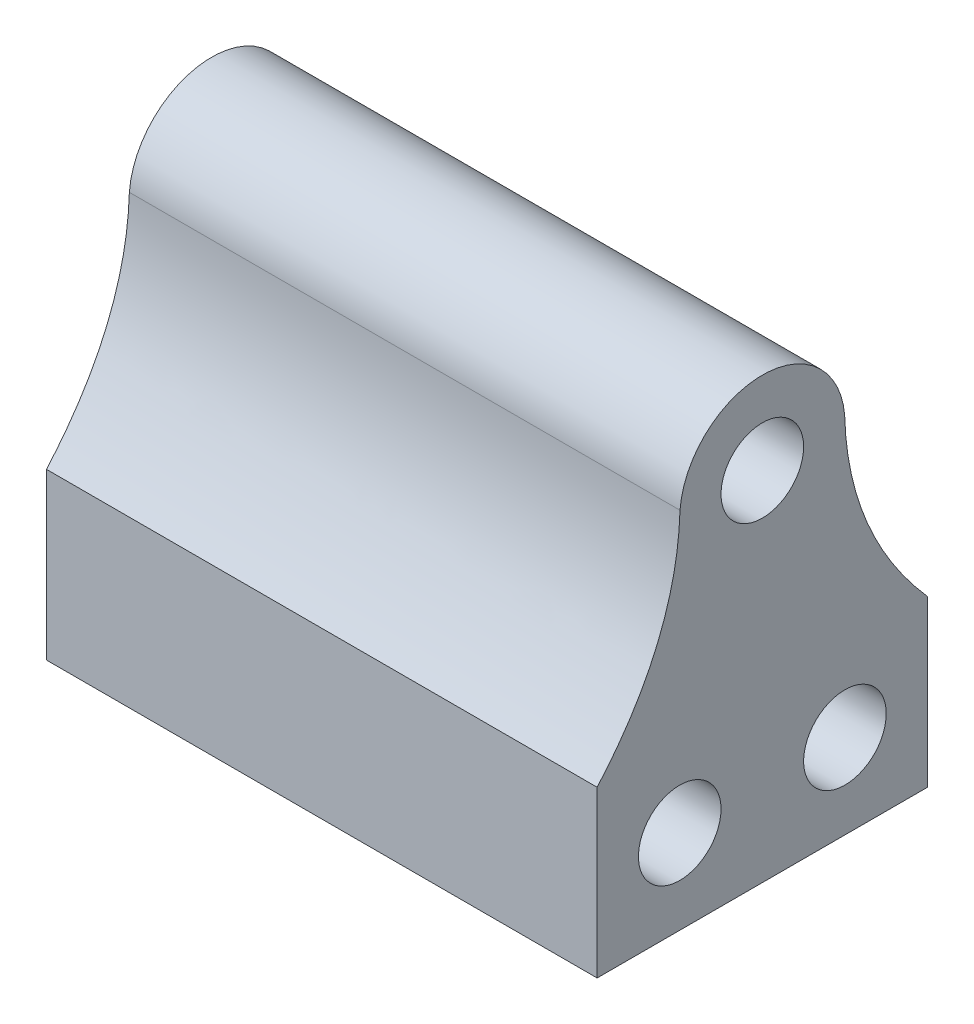
ISO-10303-21;
HEADER;
FILE_DESCRIPTION(('STEP AP214'),'2;1');
FILE_NAME('part.step','',(''),(''),'','','');
FILE_SCHEMA(('AUTOMOTIVE_DESIGN { 1 0 10303 214 1 1 1 1 }'));
ENDSEC;
DATA;
#1=APPLICATION_CONTEXT('core data for automotive mechanical design processes');
#2=APPLICATION_PROTOCOL_DEFINITION('international standard','automotive_design',2000,#1);
#3=PRODUCT_CONTEXT('',#1,'mechanical');
#4=PRODUCT('Part','Part','',(#3));
#5=PRODUCT_RELATED_PRODUCT_CATEGORY('part','',(#4));
#6=PRODUCT_DEFINITION_FORMATION('','',#4);
#7=PRODUCT_DEFINITION_CONTEXT('part definition',#1,'design');
#8=PRODUCT_DEFINITION('design','',#6,#7);
#9=PRODUCT_DEFINITION_SHAPE('','',#8);
#10=(LENGTH_UNIT() NAMED_UNIT(*) SI_UNIT(.MILLI.,.METRE.));
#11=(NAMED_UNIT(*) PLANE_ANGLE_UNIT() SI_UNIT($,.RADIAN.));
#12=(NAMED_UNIT(*) SI_UNIT($,.STERADIAN.) SOLID_ANGLE_UNIT());
#13=UNCERTAINTY_MEASURE_WITH_UNIT(LENGTH_MEASURE(1.E-05),#10,'distance_accuracy_value','');
#14=(GEOMETRIC_REPRESENTATION_CONTEXT(3) GLOBAL_UNCERTAINTY_ASSIGNED_CONTEXT((#13)) GLOBAL_UNIT_ASSIGNED_CONTEXT((#10,
#11,#12)) REPRESENTATION_CONTEXT('',''));
#15=CARTESIAN_POINT('',(0.,0.,0.));
#16=DIRECTION('',(0.,0.,1.));
#17=DIRECTION('',(1.,0.,0.));
#18=AXIS2_PLACEMENT_3D('',#15,#16,#17);
#19=CARTESIAN_POINT('',(-50.,30.,-30.));
#20=DIRECTION('',(1.,0.,0.));
#21=DIRECTION('',(0.,0.,-1.));
#22=AXIS2_PLACEMENT_3D('',#19,#20,#21);
#23=PLANE('',#22);
#24=CARTESIAN_POINT('',(-50.,64.8232846353852,0.));
#25=DIRECTION('',(1.,0.,0.));
#26=DIRECTION('',(0.,0.,-1.));
#27=AXIS2_PLACEMENT_3D('',#24,#25,#26);
#28=CIRCLE('',#27,7.5);
#29=CARTESIAN_POINT('',(-50.,64.8232846353852,-7.49999999999999));
#30=VERTEX_POINT('',#29);
#31=EDGE_CURVE('E204',#30,#30,#28,.T.);
#32=ORIENTED_EDGE('',*,*,#31,.T.);
#33=EDGE_LOOP('',(#32));
#34=FACE_BOUND('',#33,.T.);
#35=CARTESIAN_POINT('',(-50.,15.3368751333688,15.));
#36=DIRECTION('',(1.,0.,0.));
#37=DIRECTION('',(0.,0.,-1.));
#38=AXIS2_PLACEMENT_3D('',#35,#36,#37);
#39=CIRCLE('',#38,7.5);
#40=CARTESIAN_POINT('',(-50.,15.3368751333688,7.50000000000001));
#41=VERTEX_POINT('',#40);
#42=EDGE_CURVE('E215',#41,#41,#39,.T.);
#43=ORIENTED_EDGE('',*,*,#42,.T.);
#44=EDGE_LOOP('',(#43));
#45=FACE_BOUND('',#44,.T.);
#46=CARTESIAN_POINT('',(-50.,15.3368751333688,-15.));
#47=DIRECTION('',(1.,0.,0.));
#48=DIRECTION('',(0.,0.,-1.));
#49=AXIS2_PLACEMENT_3D('',#46,#47,#48);
#50=CIRCLE('',#49,7.5);
#51=CARTESIAN_POINT('',(-50.,15.3368751333688,-22.5));
#52=VERTEX_POINT('',#51);
#53=EDGE_CURVE('E225',#52,#52,#50,.T.);
#54=ORIENTED_EDGE('',*,*,#53,.T.);
#55=EDGE_LOOP('',(#54));
#56=FACE_BOUND('',#55,.T.);
#57=DIRECTION('',(0.,0.,1.));
#58=VECTOR('',#57,1.);
#59=CARTESIAN_POINT('',(-50.,0.,-30.));
#60=LINE('',#59,#58);
#61=CARTESIAN_POINT('',(-50.,0.,-30.));
#62=VERTEX_POINT('',#61);
#63=CARTESIAN_POINT('',(-50.,0.,30.));
#64=VERTEX_POINT('',#63);
#65=EDGE_CURVE('E168',#62,#64,#60,.T.);
#66=ORIENTED_EDGE('',*,*,#65,.T.);
#67=DIRECTION('',(0.,-1.,0.));
#68=VECTOR('',#67,1.);
#69=CARTESIAN_POINT('',(-50.,30.,30.));
#70=LINE('',#69,#68);
#71=CARTESIAN_POINT('',(-50.,30.,30.));
#72=VERTEX_POINT('',#71);
#73=EDGE_CURVE('E11',#72,#64,#70,.T.);
#74=ORIENTED_EDGE('',*,*,#73,.F.);
#75=CARTESIAN_POINT('',(-50.,66.0445948713286,14.9501973668437));
#76=CARTESIAN_POINT('',(-50.,46.442080305185,15.5306586318071));
#77=CARTESIAN_POINT('',(-50.,30.,30.));
#78=B_SPLINE_CURVE_WITH_KNOTS('',2,(#75,#76,#77),.UNSPECIFIED.,.F.,.F.,(3,3),(0.,1.),.UNSPECIFIED.);
#79=CARTESIAN_POINT('',(-50.,66.0445948713286,14.9501973668437));
#80=VERTEX_POINT('',#79);
#81=EDGE_CURVE('E120',#80,#72,#78,.T.);
#82=ORIENTED_EDGE('',*,*,#81,.F.);
#83=CARTESIAN_POINT('',(-50.,64.8232846353852,0.));
#84=DIRECTION('',(1.,0.,0.));
#85=DIRECTION('',(0.,0.,-1.));
#86=AXIS2_PLACEMENT_3D('',#83,#84,#85);
#87=CIRCLE('',#86,15.);
#88=CARTESIAN_POINT('',(-50.,65.984799867028,-14.9549617975661));
#89=VERTEX_POINT('',#88);
#90=EDGE_CURVE('E118',#89,#80,#87,.T.);
#91=ORIENTED_EDGE('',*,*,#90,.F.);
#92=CARTESIAN_POINT('',(-50.,30.,-30.));
#93=CARTESIAN_POINT('',(-50.,46.4130499455751,-15.5046375981463));
#94=CARTESIAN_POINT('',(-50.,65.984799867028,-14.9549617975661));
#95=B_SPLINE_CURVE_WITH_KNOTS('',2,(#92,#93,#94),.UNSPECIFIED.,.F.,.F.,(3,3),(0.,1.),.UNSPECIFIED.);
#96=CARTESIAN_POINT('',(-50.,30.,-30.));
#97=VERTEX_POINT('',#96);
#98=EDGE_CURVE('E111',#97,#89,#95,.T.);
#99=ORIENTED_EDGE('',*,*,#98,.F.);
#100=DIRECTION('',(0.,-1.,0.));
#101=VECTOR('',#100,1.);
#102=CARTESIAN_POINT('',(-50.,30.,-30.));
#103=LINE('',#102,#101);
#104=EDGE_CURVE('E97',#97,#62,#103,.T.);
#105=ORIENTED_EDGE('',*,*,#104,.T.);
#106=EDGE_LOOP('',(#66,#74,#82,#91,#99,#105));
#107=FACE_BOUND('',#106,.T.);
#108=ADVANCED_FACE('F39',(#34,#45,#56,#107),#23,.F.);
#109=CARTESIAN_POINT('',(-50.,30.,30.));
#110=DIRECTION('',(0.,0.,-1.));
#111=DIRECTION('',(-1.,0.,0.));
#112=AXIS2_PLACEMENT_3D('',#109,#110,#111);
#113=PLANE('',#112);
#114=DIRECTION('',(1.,0.,0.));
#115=VECTOR('',#114,1.);
#116=CARTESIAN_POINT('',(-50.,0.,30.));
#117=LINE('',#116,#115);
#118=CARTESIAN_POINT('',(50.,0.,30.));
#119=VERTEX_POINT('',#118);
#120=EDGE_CURVE('E166',#64,#119,#117,.T.);
#121=ORIENTED_EDGE('',*,*,#120,.T.);
#122=DIRECTION('',(0.,-1.,0.));
#123=VECTOR('',#122,1.);
#124=CARTESIAN_POINT('',(50.,30.,30.));
#125=LINE('',#124,#123);
#126=CARTESIAN_POINT('',(50.,30.,30.));
#127=VERTEX_POINT('',#126);
#128=EDGE_CURVE('E48',#127,#119,#125,.T.);
#129=ORIENTED_EDGE('',*,*,#128,.F.);
#130=DIRECTION('',(1.,0.,0.));
#131=VECTOR('',#130,1.);
#132=CARTESIAN_POINT('',(-50.,30.,30.));
#133=LINE('',#132,#131);
#134=EDGE_CURVE('E82',#72,#127,#133,.T.);
#135=ORIENTED_EDGE('',*,*,#134,.F.);
#136=ORIENTED_EDGE('',*,*,#73,.T.);
#137=EDGE_LOOP('',(#121,#129,#135,#136));
#138=FACE_BOUND('',#137,.T.);
#139=ADVANCED_FACE('F159',(#138),#113,.F.);
#140=CARTESIAN_POINT('',(50.,30.,-30.));
#141=DIRECTION('',(-1.,0.,0.));
#142=DIRECTION('',(0.,0.,1.));
#143=AXIS2_PLACEMENT_3D('',#140,#141,#142);
#144=PLANE('',#143);
#145=CARTESIAN_POINT('',(50.,64.8232846353852,0.));
#146=DIRECTION('',(1.,0.,0.));
#147=DIRECTION('',(0.,0.,-1.));
#148=AXIS2_PLACEMENT_3D('',#145,#146,#147);
#149=CIRCLE('',#148,7.5);
#150=CARTESIAN_POINT('',(50.,64.8232846353852,-7.50000000000001));
#151=VERTEX_POINT('',#150);
#152=EDGE_CURVE('E210',#151,#151,#149,.T.);
#153=ORIENTED_EDGE('',*,*,#152,.F.);
#154=EDGE_LOOP('',(#153));
#155=FACE_BOUND('',#154,.T.);
#156=CARTESIAN_POINT('',(50.,15.3368751333688,15.));
#157=DIRECTION('',(1.,0.,0.));
#158=DIRECTION('',(0.,0.,-1.));
#159=AXIS2_PLACEMENT_3D('',#156,#157,#158);
#160=CIRCLE('',#159,7.5);
#161=CARTESIAN_POINT('',(50.,15.3368751333688,7.49999999999999));
#162=VERTEX_POINT('',#161);
#163=EDGE_CURVE('E221',#162,#162,#160,.T.);
#164=ORIENTED_EDGE('',*,*,#163,.F.);
#165=EDGE_LOOP('',(#164));
#166=FACE_BOUND('',#165,.T.);
#167=CARTESIAN_POINT('',(50.,15.3368751333688,-15.));
#168=DIRECTION('',(1.,0.,0.));
#169=DIRECTION('',(0.,0.,-1.));
#170=AXIS2_PLACEMENT_3D('',#167,#168,#169);
#171=CIRCLE('',#170,7.5);
#172=CARTESIAN_POINT('',(50.,15.3368751333688,-22.5));
#173=VERTEX_POINT('',#172);
#174=EDGE_CURVE('E228',#173,#173,#171,.T.);
#175=ORIENTED_EDGE('',*,*,#174,.F.);
#176=EDGE_LOOP('',(#175));
#177=FACE_BOUND('',#176,.T.);
#178=DIRECTION('',(0.,0.,-1.));
#179=VECTOR('',#178,1.);
#180=CARTESIAN_POINT('',(50.,0.,-30.));
#181=LINE('',#180,#179);
#182=CARTESIAN_POINT('',(50.,0.,-30.));
#183=VERTEX_POINT('',#182);
#184=EDGE_CURVE('E72',#119,#183,#181,.T.);
#185=ORIENTED_EDGE('',*,*,#184,.T.);
#186=DIRECTION('',(0.,-1.,0.));
#187=VECTOR('',#186,1.);
#188=CARTESIAN_POINT('',(50.,30.,-30.));
#189=LINE('',#188,#187);
#190=CARTESIAN_POINT('',(50.,30.,-30.));
#191=VERTEX_POINT('',#190);
#192=EDGE_CURVE('E56',#191,#183,#189,.T.);
#193=ORIENTED_EDGE('',*,*,#192,.F.);
#194=CARTESIAN_POINT('',(50.,30.,-30.));
#195=CARTESIAN_POINT('',(50.,46.4130499455751,-15.5046375981464));
#196=CARTESIAN_POINT('',(50.,65.984799867028,-14.9549617975661));
#197=B_SPLINE_CURVE_WITH_KNOTS('',2,(#194,#195,#196),.UNSPECIFIED.,.F.,.F.,(3,3),(0.,1.),.UNSPECIFIED.);
#198=CARTESIAN_POINT('',(50.,65.984799867028,-14.9549617975661));
#199=VERTEX_POINT('',#198);
#200=EDGE_CURVE('E113',#191,#199,#197,.T.);
#201=ORIENTED_EDGE('',*,*,#200,.T.);
#202=CARTESIAN_POINT('',(50.,64.8232846353852,0.));
#203=DIRECTION('',(1.,0.,0.));
#204=DIRECTION('',(0.,0.,-1.));
#205=AXIS2_PLACEMENT_3D('',#202,#203,#204);
#206=CIRCLE('',#205,15.);
#207=CARTESIAN_POINT('',(50.,66.0445948713286,14.9501973668437));
#208=VERTEX_POINT('',#207);
#209=EDGE_CURVE('E127',#199,#208,#206,.T.);
#210=ORIENTED_EDGE('',*,*,#209,.T.);
#211=CARTESIAN_POINT('',(50.,66.0445948713286,14.9501973668437));
#212=CARTESIAN_POINT('',(50.,46.442080305185,15.5306586318071));
#213=CARTESIAN_POINT('',(50.,30.,30.));
#214=B_SPLINE_CURVE_WITH_KNOTS('',2,(#211,#212,#213),.UNSPECIFIED.,.F.,.F.,(3,3),(0.,1.),.UNSPECIFIED.);
#215=EDGE_CURVE('E173',#208,#127,#214,.T.);
#216=ORIENTED_EDGE('',*,*,#215,.T.);
#217=ORIENTED_EDGE('',*,*,#128,.T.);
#218=EDGE_LOOP('',(#185,#193,#201,#210,#216,#217));
#219=FACE_BOUND('',#218,.T.);
#220=ADVANCED_FACE('F157',(#155,#166,#177,#219),#144,.F.);
#221=CARTESIAN_POINT('',(-50.,30.,-30.));
#222=DIRECTION('',(0.,0.,1.));
#223=DIRECTION('',(1.,0.,0.));
#224=AXIS2_PLACEMENT_3D('',#221,#222,#223);
#225=PLANE('',#224);
#226=DIRECTION('',(-1.,0.,0.));
#227=VECTOR('',#226,1.);
#228=CARTESIAN_POINT('',(-50.,0.,-30.));
#229=LINE('',#228,#227);
#230=EDGE_CURVE('E77',#183,#62,#229,.T.);
#231=ORIENTED_EDGE('',*,*,#230,.T.);
#232=ORIENTED_EDGE('',*,*,#104,.F.);
#233=DIRECTION('',(-1.,0.,0.));
#234=VECTOR('',#233,1.);
#235=CARTESIAN_POINT('',(-50.,30.,-30.));
#236=LINE('',#235,#234);
#237=EDGE_CURVE('E100',#191,#97,#236,.T.);
#238=ORIENTED_EDGE('',*,*,#237,.F.);
#239=ORIENTED_EDGE('',*,*,#192,.T.);
#240=EDGE_LOOP('',(#231,#232,#238,#239));
#241=FACE_BOUND('',#240,.T.);
#242=ADVANCED_FACE('F99',(#241),#225,.F.);
#243=CARTESIAN_POINT('',(0.,0.,0.));
#244=DIRECTION('',(0.,1.,0.));
#245=DIRECTION('',(0.,0.,1.));
#246=AXIS2_PLACEMENT_3D('',#243,#244,#245);
#247=PLANE('',#246);
#248=ORIENTED_EDGE('',*,*,#65,.F.);
#249=ORIENTED_EDGE('',*,*,#230,.F.);
#250=ORIENTED_EDGE('',*,*,#184,.F.);
#251=ORIENTED_EDGE('',*,*,#120,.F.);
#252=EDGE_LOOP('',(#248,#249,#250,#251));
#253=FACE_BOUND('',#252,.T.);
#254=ADVANCED_FACE('F150',(#253),#247,.F.);
#255=DIRECTION('',(1.,0.,0.));
#256=VECTOR('',#255,1.);
#257=SURFACE_OF_LINEAR_EXTRUSION('',#78,#256);
#258=ORIENTED_EDGE('',*,*,#215,.F.);
#259=DIRECTION('',(1.,0.,0.));
#260=VECTOR('',#259,1.);
#261=CARTESIAN_POINT('',(-50.,66.0445948713286,14.9501973668437));
#262=LINE('',#261,#260);
#263=EDGE_CURVE('E187',#80,#208,#262,.T.);
#264=ORIENTED_EDGE('',*,*,#263,.F.);
#265=ORIENTED_EDGE('',*,*,#81,.T.);
#266=ORIENTED_EDGE('',*,*,#134,.T.);
#267=EDGE_LOOP('',(#258,#264,#265,#266));
#268=FACE_BOUND('',#267,.T.);
#269=ADVANCED_FACE('F147',(#268),#257,.T.);
#270=CARTESIAN_POINT('',(-50.,64.8232846353852,0.));
#271=DIRECTION('',(1.,0.,0.));
#272=DIRECTION('',(0.,0.,-1.));
#273=AXIS2_PLACEMENT_3D('',#270,#271,#272);
#274=CYLINDRICAL_SURFACE('',#273,15.);
#275=ORIENTED_EDGE('',*,*,#209,.F.);
#276=DIRECTION('',(1.,0.,0.));
#277=VECTOR('',#276,1.);
#278=CARTESIAN_POINT('',(-50.,65.984799867028,-14.9549617975661));
#279=LINE('',#278,#277);
#280=EDGE_CURVE('E124',#89,#199,#279,.T.);
#281=ORIENTED_EDGE('',*,*,#280,.F.);
#282=ORIENTED_EDGE('',*,*,#90,.T.);
#283=ORIENTED_EDGE('',*,*,#263,.T.);
#284=EDGE_LOOP('',(#275,#281,#282,#283));
#285=FACE_BOUND('',#284,.T.);
#286=ADVANCED_FACE('F145',(#285),#274,.T.);
#287=DIRECTION('',(1.,0.,0.));
#288=VECTOR('',#287,1.);
#289=SURFACE_OF_LINEAR_EXTRUSION('',#95,#288);
#290=ORIENTED_EDGE('',*,*,#200,.F.);
#291=ORIENTED_EDGE('',*,*,#237,.T.);
#292=ORIENTED_EDGE('',*,*,#98,.T.);
#293=ORIENTED_EDGE('',*,*,#280,.T.);
#294=EDGE_LOOP('',(#290,#291,#292,#293));
#295=FACE_BOUND('',#294,.T.);
#296=ADVANCED_FACE('F110',(#295),#289,.T.);
#297=CARTESIAN_POINT('',(-50.,15.3368751333688,-15.));
#298=DIRECTION('',(1.,0.,0.));
#299=DIRECTION('',(0.,0.,-1.));
#300=AXIS2_PLACEMENT_3D('',#297,#298,#299);
#301=CYLINDRICAL_SURFACE('',#300,7.5);
#302=ORIENTED_EDGE('',*,*,#53,.F.);
#303=EDGE_LOOP('',(#302));
#304=FACE_BOUND('',#303,.T.);
#305=ORIENTED_EDGE('',*,*,#174,.T.);
#306=EDGE_LOOP('',(#305));
#307=FACE_BOUND('',#306,.T.);
#308=ADVANCED_FACE('F144',(#304,#307),#301,.F.);
#309=CARTESIAN_POINT('',(-50.,15.3368751333688,15.));
#310=DIRECTION('',(1.,0.,0.));
#311=DIRECTION('',(0.,0.,-1.));
#312=AXIS2_PLACEMENT_3D('',#309,#310,#311);
#313=CYLINDRICAL_SURFACE('',#312,7.5);
#314=ORIENTED_EDGE('',*,*,#42,.F.);
#315=EDGE_LOOP('',(#314));
#316=FACE_BOUND('',#315,.T.);
#317=ORIENTED_EDGE('',*,*,#163,.T.);
#318=EDGE_LOOP('',(#317));
#319=FACE_BOUND('',#318,.T.);
#320=ADVANCED_FACE('F235',(#316,#319),#313,.F.);
#321=CARTESIAN_POINT('',(-50.,64.8232846353852,0.));
#322=DIRECTION('',(1.,0.,0.));
#323=DIRECTION('',(0.,0.,-1.));
#324=AXIS2_PLACEMENT_3D('',#321,#322,#323);
#325=CYLINDRICAL_SURFACE('',#324,7.5);
#326=ORIENTED_EDGE('',*,*,#31,.F.);
#327=EDGE_LOOP('',(#326));
#328=FACE_BOUND('',#327,.T.);
#329=ORIENTED_EDGE('',*,*,#152,.T.);
#330=EDGE_LOOP('',(#329));
#331=FACE_BOUND('',#330,.T.);
#332=ADVANCED_FACE('F240',(#328,#331),#325,.F.);
#333=CLOSED_SHELL('',(#108,#139,#220,#242,#254,#269,#286,#296,#308,#320,#332));
#334=MANIFOLD_SOLID_BREP('B2',#333);
#335=ADVANCED_BREP_SHAPE_REPRESENTATION('',(#18,#334),#14);
#336=SHAPE_DEFINITION_REPRESENTATION(#9,#335);
ENDSEC;
END-ISO-10303-21;
